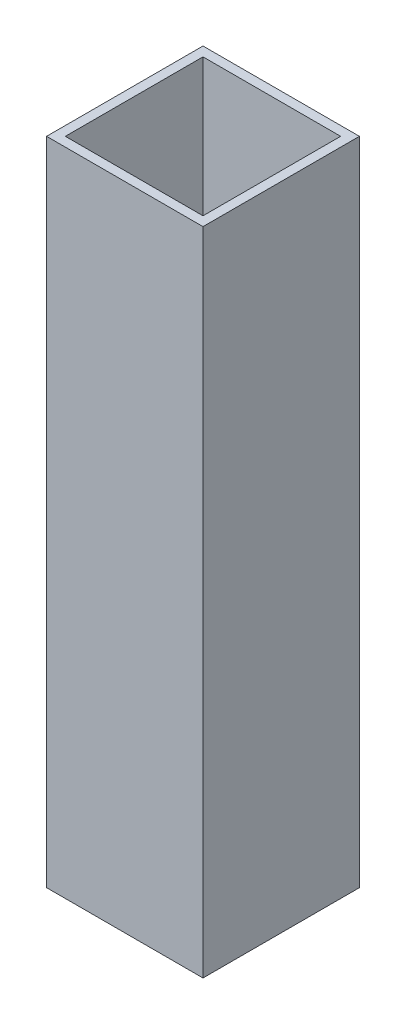
ISO-10303-21;
HEADER;
FILE_DESCRIPTION(('STEP AP214'),'2;1');
FILE_NAME('part.step','',(''),(''),'','','');
FILE_SCHEMA(('AUTOMOTIVE_DESIGN { 1 0 10303 214 1 1 1 1 }'));
ENDSEC;
DATA;
#1=APPLICATION_CONTEXT('core data for automotive mechanical design processes');
#2=APPLICATION_PROTOCOL_DEFINITION('international standard','automotive_design',2000,#1);
#3=PRODUCT_CONTEXT('',#1,'mechanical');
#4=PRODUCT('Part','Part','',(#3));
#5=PRODUCT_RELATED_PRODUCT_CATEGORY('part','',(#4));
#6=PRODUCT_DEFINITION_FORMATION('','',#4);
#7=PRODUCT_DEFINITION_CONTEXT('part definition',#1,'design');
#8=PRODUCT_DEFINITION('design','',#6,#7);
#9=PRODUCT_DEFINITION_SHAPE('','',#8);
#10=(LENGTH_UNIT() NAMED_UNIT(*) SI_UNIT(.MILLI.,.METRE.));
#11=(NAMED_UNIT(*) PLANE_ANGLE_UNIT() SI_UNIT($,.RADIAN.));
#12=(NAMED_UNIT(*) SI_UNIT($,.STERADIAN.) SOLID_ANGLE_UNIT());
#13=UNCERTAINTY_MEASURE_WITH_UNIT(LENGTH_MEASURE(1.E-05),#10,'distance_accuracy_value','');
#14=(GEOMETRIC_REPRESENTATION_CONTEXT(3) GLOBAL_UNCERTAINTY_ASSIGNED_CONTEXT((#13)) GLOBAL_UNIT_ASSIGNED_CONTEXT((#10,
#11,#12)) REPRESENTATION_CONTEXT('',''));
#15=CARTESIAN_POINT('',(0.,0.,0.));
#16=DIRECTION('',(0.,0.,1.));
#17=DIRECTION('',(1.,0.,0.));
#18=AXIS2_PLACEMENT_3D('',#15,#16,#17);
#19=CARTESIAN_POINT('',(0.,52.,0.));
#20=DIRECTION('',(0.,1.,0.));
#21=DIRECTION('',(0.,0.,1.));
#22=AXIS2_PLACEMENT_3D('',#19,#20,#21);
#23=PLANE('',#22);
#24=DIRECTION('',(0.,0.,1.));
#25=VECTOR('',#24,1.);
#26=CARTESIAN_POINT('',(-26.6277544150477,52.,-1.83717263154866));
#27=LINE('',#26,#25);
#28=CARTESIAN_POINT('',(-26.6277544150477,52.,-1.83717263154866));
#29=VERTEX_POINT('',#28);
#30=CARTESIAN_POINT('',(-26.6277544150477,52.,10.6628273684513));
#31=VERTEX_POINT('',#30);
#32=EDGE_CURVE('E138',#29,#31,#27,.T.);
#33=ORIENTED_EDGE('',*,*,#32,.T.);
#34=DIRECTION('',(1.,0.,0.));
#35=VECTOR('',#34,1.);
#36=CARTESIAN_POINT('',(-26.6277544150477,52.,10.6628273684513));
#37=LINE('',#36,#35);
#38=CARTESIAN_POINT('',(-14.1277544150477,52.,10.6628273684513));
#39=VERTEX_POINT('',#38);
#40=EDGE_CURVE('E141',#31,#39,#37,.T.);
#41=ORIENTED_EDGE('',*,*,#40,.T.);
#42=DIRECTION('',(0.,0.,-1.));
#43=VECTOR('',#42,1.);
#44=CARTESIAN_POINT('',(-14.1277544150477,52.,-1.83717263154866));
#45=LINE('',#44,#43);
#46=CARTESIAN_POINT('',(-14.1277544150477,52.,-1.83717263154866));
#47=VERTEX_POINT('',#46);
#48=EDGE_CURVE('E144',#39,#47,#45,.T.);
#49=ORIENTED_EDGE('',*,*,#48,.T.);
#50=DIRECTION('',(-1.,0.,0.));
#51=VECTOR('',#50,1.);
#52=CARTESIAN_POINT('',(-26.6277544150477,52.,-1.83717263154866));
#53=LINE('',#52,#51);
#54=EDGE_CURVE('E146',#47,#29,#53,.T.);
#55=ORIENTED_EDGE('',*,*,#54,.T.);
#56=EDGE_LOOP('',(#33,#41,#49,#55));
#57=FACE_BOUND('',#56,.T.);
#58=DIRECTION('',(-1.,0.,0.));
#59=VECTOR('',#58,1.);
#60=CARTESIAN_POINT('',(-25.8777544150477,52.,-1.08717263154866));
#61=LINE('',#60,#59);
#62=CARTESIAN_POINT('',(-14.8777544150477,52.,-1.08717263154866));
#63=VERTEX_POINT('',#62);
#64=CARTESIAN_POINT('',(-25.8777544150477,52.,-1.08717263154866));
#65=VERTEX_POINT('',#64);
#66=EDGE_CURVE('E110',#63,#65,#61,.T.);
#67=ORIENTED_EDGE('',*,*,#66,.F.);
#68=DIRECTION('',(0.,0.,-1.));
#69=VECTOR('',#68,1.);
#70=CARTESIAN_POINT('',(-14.8777544150477,52.,-1.08717263154866));
#71=LINE('',#70,#69);
#72=CARTESIAN_POINT('',(-14.8777544150477,52.,9.91282736845134));
#73=VERTEX_POINT('',#72);
#74=EDGE_CURVE('E102',#73,#63,#71,.T.);
#75=ORIENTED_EDGE('',*,*,#74,.F.);
#76=DIRECTION('',(1.,0.,0.));
#77=VECTOR('',#76,1.);
#78=CARTESIAN_POINT('',(-25.8777544150477,52.,9.91282736845134));
#79=LINE('',#78,#77);
#80=CARTESIAN_POINT('',(-25.8777544150477,52.,9.91282736845134));
#81=VERTEX_POINT('',#80);
#82=EDGE_CURVE('E124',#81,#73,#79,.T.);
#83=ORIENTED_EDGE('',*,*,#82,.F.);
#84=DIRECTION('',(0.,0.,1.));
#85=VECTOR('',#84,1.);
#86=CARTESIAN_POINT('',(-25.8777544150477,52.,-1.08717263154866));
#87=LINE('',#86,#85);
#88=EDGE_CURVE('E122',#65,#81,#87,.T.);
#89=ORIENTED_EDGE('',*,*,#88,.F.);
#90=EDGE_LOOP('',(#67,#75,#83,#89));
#91=FACE_BOUND('',#90,.T.);
#92=ADVANCED_FACE('F37',(#57,#91),#23,.T.);
#93=CARTESIAN_POINT('',(0.,0.,0.));
#94=DIRECTION('',(0.,1.,0.));
#95=DIRECTION('',(0.,0.,1.));
#96=AXIS2_PLACEMENT_3D('',#93,#94,#95);
#97=PLANE('',#96);
#98=DIRECTION('',(0.,0.,1.));
#99=VECTOR('',#98,1.);
#100=CARTESIAN_POINT('',(-26.6277544150477,0.,-1.83717263154866));
#101=LINE('',#100,#99);
#102=CARTESIAN_POINT('',(-26.6277544150477,0.,-1.83717263154866));
#103=VERTEX_POINT('',#102);
#104=CARTESIAN_POINT('',(-26.6277544150477,0.,10.6628273684513));
#105=VERTEX_POINT('',#104);
#106=EDGE_CURVE('E118',#103,#105,#101,.T.);
#107=ORIENTED_EDGE('',*,*,#106,.F.);
#108=DIRECTION('',(-1.,0.,0.));
#109=VECTOR('',#108,1.);
#110=CARTESIAN_POINT('',(-26.6277544150477,0.,-1.83717263154866));
#111=LINE('',#110,#109);
#112=CARTESIAN_POINT('',(-14.1277544150477,0.,-1.83717263154866));
#113=VERTEX_POINT('',#112);
#114=EDGE_CURVE('E142',#113,#103,#111,.T.);
#115=ORIENTED_EDGE('',*,*,#114,.F.);
#116=DIRECTION('',(0.,0.,-1.));
#117=VECTOR('',#116,1.);
#118=CARTESIAN_POINT('',(-14.1277544150477,0.,-1.83717263154866));
#119=LINE('',#118,#117);
#120=CARTESIAN_POINT('',(-14.1277544150477,0.,10.6628273684513));
#121=VERTEX_POINT('',#120);
#122=EDGE_CURVE('E153',#121,#113,#119,.T.);
#123=ORIENTED_EDGE('',*,*,#122,.F.);
#124=DIRECTION('',(1.,0.,0.));
#125=VECTOR('',#124,1.);
#126=CARTESIAN_POINT('',(-26.6277544150477,0.,10.6628273684513));
#127=LINE('',#126,#125);
#128=EDGE_CURVE('E151',#105,#121,#127,.T.);
#129=ORIENTED_EDGE('',*,*,#128,.F.);
#130=EDGE_LOOP('',(#107,#115,#123,#129));
#131=FACE_BOUND('',#130,.T.);
#132=DIRECTION('',(0.,0.,-1.));
#133=VECTOR('',#132,1.);
#134=CARTESIAN_POINT('',(-14.8777544150477,0.,-1.08717263154866));
#135=LINE('',#134,#133);
#136=CARTESIAN_POINT('',(-14.8777544150477,0.,9.91282736845134));
#137=VERTEX_POINT('',#136);
#138=CARTESIAN_POINT('',(-14.8777544150477,0.,-1.08717263154866));
#139=VERTEX_POINT('',#138);
#140=EDGE_CURVE('E60',#137,#139,#135,.T.);
#141=ORIENTED_EDGE('',*,*,#140,.T.);
#142=DIRECTION('',(-1.,0.,0.));
#143=VECTOR('',#142,1.);
#144=CARTESIAN_POINT('',(-25.8777544150477,0.,-1.08717263154866));
#145=LINE('',#144,#143);
#146=CARTESIAN_POINT('',(-25.8777544150477,0.,-1.08717263154866));
#147=VERTEX_POINT('',#146);
#148=EDGE_CURVE('E117',#139,#147,#145,.T.);
#149=ORIENTED_EDGE('',*,*,#148,.T.);
#150=DIRECTION('',(0.,0.,1.));
#151=VECTOR('',#150,1.);
#152=CARTESIAN_POINT('',(-25.8777544150477,0.,-1.08717263154866));
#153=LINE('',#152,#151);
#154=CARTESIAN_POINT('',(-25.8777544150477,0.,9.91282736845134));
#155=VERTEX_POINT('',#154);
#156=EDGE_CURVE('E130',#147,#155,#153,.T.);
#157=ORIENTED_EDGE('',*,*,#156,.T.);
#158=DIRECTION('',(1.,0.,0.));
#159=VECTOR('',#158,1.);
#160=CARTESIAN_POINT('',(-25.8777544150477,0.,9.91282736845134));
#161=LINE('',#160,#159);
#162=EDGE_CURVE('E111',#155,#137,#161,.T.);
#163=ORIENTED_EDGE('',*,*,#162,.T.);
#164=EDGE_LOOP('',(#141,#149,#157,#163));
#165=FACE_BOUND('',#164,.T.);
#166=ADVANCED_FACE('F171',(#131,#165),#97,.F.);
#167=CARTESIAN_POINT('',(-26.6277544150477,52.,-1.83717263154866));
#168=DIRECTION('',(1.,0.,0.));
#169=DIRECTION('',(0.,0.,-1.));
#170=AXIS2_PLACEMENT_3D('',#167,#168,#169);
#171=PLANE('',#170);
#172=ORIENTED_EDGE('',*,*,#106,.T.);
#173=DIRECTION('',(0.,-1.,0.));
#174=VECTOR('',#173,1.);
#175=CARTESIAN_POINT('',(-26.6277544150477,52.,10.6628273684513));
#176=LINE('',#175,#174);
#177=EDGE_CURVE('E11',#31,#105,#176,.T.);
#178=ORIENTED_EDGE('',*,*,#177,.F.);
#179=ORIENTED_EDGE('',*,*,#32,.F.);
#180=DIRECTION('',(0.,-1.,0.));
#181=VECTOR('',#180,1.);
#182=CARTESIAN_POINT('',(-26.6277544150477,52.,-1.83717263154866));
#183=LINE('',#182,#181);
#184=EDGE_CURVE('E148',#29,#103,#183,.T.);
#185=ORIENTED_EDGE('',*,*,#184,.T.);
#186=EDGE_LOOP('',(#172,#178,#179,#185));
#187=FACE_BOUND('',#186,.T.);
#188=ADVANCED_FACE('F39',(#187),#171,.F.);
#189=CARTESIAN_POINT('',(-26.6277544150477,52.,10.6628273684513));
#190=DIRECTION('',(0.,0.,-1.));
#191=DIRECTION('',(-1.,0.,0.));
#192=AXIS2_PLACEMENT_3D('',#189,#190,#191);
#193=PLANE('',#192);
#194=ORIENTED_EDGE('',*,*,#128,.T.);
#195=DIRECTION('',(0.,-1.,0.));
#196=VECTOR('',#195,1.);
#197=CARTESIAN_POINT('',(-14.1277544150477,52.,10.6628273684513));
#198=LINE('',#197,#196);
#199=EDGE_CURVE('E45',#39,#121,#198,.T.);
#200=ORIENTED_EDGE('',*,*,#199,.F.);
#201=ORIENTED_EDGE('',*,*,#40,.F.);
#202=ORIENTED_EDGE('',*,*,#177,.T.);
#203=EDGE_LOOP('',(#194,#200,#201,#202));
#204=FACE_BOUND('',#203,.T.);
#205=ADVANCED_FACE('F181',(#204),#193,.F.);
#206=CARTESIAN_POINT('',(-14.1277544150477,52.,-1.83717263154866));
#207=DIRECTION('',(-1.,0.,0.));
#208=DIRECTION('',(0.,0.,1.));
#209=AXIS2_PLACEMENT_3D('',#206,#207,#208);
#210=PLANE('',#209);
#211=ORIENTED_EDGE('',*,*,#122,.T.);
#212=DIRECTION('',(0.,-1.,0.));
#213=VECTOR('',#212,1.);
#214=CARTESIAN_POINT('',(-14.1277544150477,52.,-1.83717263154866));
#215=LINE('',#214,#213);
#216=EDGE_CURVE('E158',#47,#113,#215,.T.);
#217=ORIENTED_EDGE('',*,*,#216,.F.);
#218=ORIENTED_EDGE('',*,*,#48,.F.);
#219=ORIENTED_EDGE('',*,*,#199,.T.);
#220=EDGE_LOOP('',(#211,#217,#218,#219));
#221=FACE_BOUND('',#220,.T.);
#222=ADVANCED_FACE('F165',(#221),#210,.F.);
#223=CARTESIAN_POINT('',(-26.6277544150477,52.,-1.83717263154866));
#224=DIRECTION('',(0.,0.,1.));
#225=DIRECTION('',(1.,0.,0.));
#226=AXIS2_PLACEMENT_3D('',#223,#224,#225);
#227=PLANE('',#226);
#228=ORIENTED_EDGE('',*,*,#114,.T.);
#229=ORIENTED_EDGE('',*,*,#184,.F.);
#230=ORIENTED_EDGE('',*,*,#54,.F.);
#231=ORIENTED_EDGE('',*,*,#216,.T.);
#232=EDGE_LOOP('',(#228,#229,#230,#231));
#233=FACE_BOUND('',#232,.T.);
#234=ADVANCED_FACE('F175',(#233),#227,.F.);
#235=CARTESIAN_POINT('',(-14.8777544150477,52.,-1.08717263154866));
#236=DIRECTION('',(-1.,0.,0.));
#237=DIRECTION('',(0.,0.,1.));
#238=AXIS2_PLACEMENT_3D('',#235,#236,#237);
#239=PLANE('',#238);
#240=ORIENTED_EDGE('',*,*,#140,.F.);
#241=DIRECTION('',(0.,-1.,0.));
#242=VECTOR('',#241,1.);
#243=CARTESIAN_POINT('',(-14.8777544150477,52.,9.91282736845134));
#244=LINE('',#243,#242);
#245=EDGE_CURVE('E106',#73,#137,#244,.T.);
#246=ORIENTED_EDGE('',*,*,#245,.F.);
#247=ORIENTED_EDGE('',*,*,#74,.T.);
#248=DIRECTION('',(0.,-1.,0.));
#249=VECTOR('',#248,1.);
#250=CARTESIAN_POINT('',(-14.8777544150477,52.,-1.08717263154866));
#251=LINE('',#250,#249);
#252=EDGE_CURVE('E105',#63,#139,#251,.T.);
#253=ORIENTED_EDGE('',*,*,#252,.T.);
#254=EDGE_LOOP('',(#240,#246,#247,#253));
#255=FACE_BOUND('',#254,.T.);
#256=ADVANCED_FACE('F104',(#255),#239,.T.);
#257=CARTESIAN_POINT('',(-25.8777544150477,52.,-1.08717263154866));
#258=DIRECTION('',(0.,0.,1.));
#259=DIRECTION('',(1.,0.,0.));
#260=AXIS2_PLACEMENT_3D('',#257,#258,#259);
#261=PLANE('',#260);
#262=ORIENTED_EDGE('',*,*,#148,.F.);
#263=ORIENTED_EDGE('',*,*,#252,.F.);
#264=ORIENTED_EDGE('',*,*,#66,.T.);
#265=DIRECTION('',(0.,-1.,0.));
#266=VECTOR('',#265,1.);
#267=CARTESIAN_POINT('',(-25.8777544150477,52.,-1.08717263154866));
#268=LINE('',#267,#266);
#269=EDGE_CURVE('E119',#65,#147,#268,.T.);
#270=ORIENTED_EDGE('',*,*,#269,.T.);
#271=EDGE_LOOP('',(#262,#263,#264,#270));
#272=FACE_BOUND('',#271,.T.);
#273=ADVANCED_FACE('F114',(#272),#261,.T.);
#274=CARTESIAN_POINT('',(-25.8777544150477,52.,-1.08717263154866));
#275=DIRECTION('',(1.,0.,0.));
#276=DIRECTION('',(0.,0.,-1.));
#277=AXIS2_PLACEMENT_3D('',#274,#275,#276);
#278=PLANE('',#277);
#279=ORIENTED_EDGE('',*,*,#156,.F.);
#280=ORIENTED_EDGE('',*,*,#269,.F.);
#281=ORIENTED_EDGE('',*,*,#88,.T.);
#282=DIRECTION('',(0.,-1.,0.));
#283=VECTOR('',#282,1.);
#284=CARTESIAN_POINT('',(-25.8777544150477,52.,9.91282736845134));
#285=LINE('',#284,#283);
#286=EDGE_CURVE('E52',#81,#155,#285,.T.);
#287=ORIENTED_EDGE('',*,*,#286,.T.);
#288=EDGE_LOOP('',(#279,#280,#281,#287));
#289=FACE_BOUND('',#288,.T.);
#290=ADVANCED_FACE('F204',(#289),#278,.T.);
#291=CARTESIAN_POINT('',(-25.8777544150477,52.,9.91282736845134));
#292=DIRECTION('',(0.,0.,-1.));
#293=DIRECTION('',(-1.,0.,0.));
#294=AXIS2_PLACEMENT_3D('',#291,#292,#293);
#295=PLANE('',#294);
#296=ORIENTED_EDGE('',*,*,#162,.F.);
#297=ORIENTED_EDGE('',*,*,#286,.F.);
#298=ORIENTED_EDGE('',*,*,#82,.T.);
#299=ORIENTED_EDGE('',*,*,#245,.T.);
#300=EDGE_LOOP('',(#296,#297,#298,#299));
#301=FACE_BOUND('',#300,.T.);
#302=ADVANCED_FACE('F208',(#301),#295,.T.);
#303=CLOSED_SHELL('',(#92,#166,#188,#205,#222,#234,#256,#273,#290,#302));
#304=MANIFOLD_SOLID_BREP('B2',#303);
#305=ADVANCED_BREP_SHAPE_REPRESENTATION('',(#18,#304),#14);
#306=SHAPE_DEFINITION_REPRESENTATION(#9,#305);
ENDSEC;
END-ISO-10303-21;
